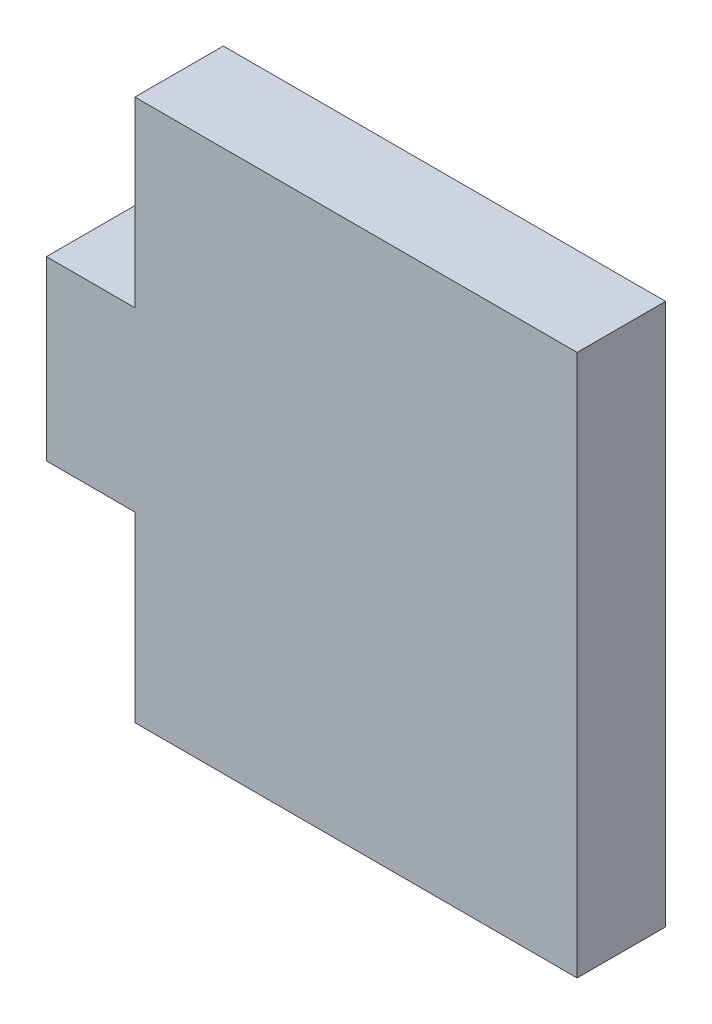
ISO-10303-21;
HEADER;
FILE_DESCRIPTION(('STEP AP214'),'2;1');
FILE_NAME('part.step','',(''),(''),'','','');
FILE_SCHEMA(('AUTOMOTIVE_DESIGN { 1 0 10303 214 1 1 1 1 }'));
ENDSEC;
DATA;
#1=APPLICATION_CONTEXT('core data for automotive mechanical design processes');
#2=APPLICATION_PROTOCOL_DEFINITION('international standard','automotive_design',2000,#1);
#3=PRODUCT_CONTEXT('',#1,'mechanical');
#4=PRODUCT('Part','Part','',(#3));
#5=PRODUCT_RELATED_PRODUCT_CATEGORY('part','',(#4));
#6=PRODUCT_DEFINITION_FORMATION('','',#4);
#7=PRODUCT_DEFINITION_CONTEXT('part definition',#1,'design');
#8=PRODUCT_DEFINITION('design','',#6,#7);
#9=PRODUCT_DEFINITION_SHAPE('','',#8);
#10=(LENGTH_UNIT() NAMED_UNIT(*) SI_UNIT(.MILLI.,.METRE.));
#11=(NAMED_UNIT(*) PLANE_ANGLE_UNIT() SI_UNIT($,.RADIAN.));
#12=(NAMED_UNIT(*) SI_UNIT($,.STERADIAN.) SOLID_ANGLE_UNIT());
#13=UNCERTAINTY_MEASURE_WITH_UNIT(LENGTH_MEASURE(1.E-05),#10,'distance_accuracy_value','');
#14=(GEOMETRIC_REPRESENTATION_CONTEXT(3) GLOBAL_UNCERTAINTY_ASSIGNED_CONTEXT((#13)) GLOBAL_UNIT_ASSIGNED_CONTEXT((#10,
#11,#12)) REPRESENTATION_CONTEXT('',''));
#15=CARTESIAN_POINT('',(0.,0.,0.));
#16=DIRECTION('',(0.,0.,1.));
#17=DIRECTION('',(1.,0.,0.));
#18=AXIS2_PLACEMENT_3D('',#15,#16,#17);
#19=CARTESIAN_POINT('',(12.,12.25,4.00000000000005));
#20=DIRECTION('',(-1.,0.,0.));
#21=DIRECTION('',(0.,-1.,0.));
#22=AXIS2_PLACEMENT_3D('',#19,#20,#21);
#23=PLANE('',#22);
#24=DIRECTION('',(0.,1.,0.));
#25=VECTOR('',#24,1.);
#26=CARTESIAN_POINT('',(12.,12.25,0.));
#27=LINE('',#26,#25);
#28=CARTESIAN_POINT('',(12.,-12.25,0.));
#29=VERTEX_POINT('',#28);
#30=CARTESIAN_POINT('',(12.,12.25,0.));
#31=VERTEX_POINT('',#30);
#32=EDGE_CURVE('E126',#29,#31,#27,.T.);
#33=ORIENTED_EDGE('',*,*,#32,.T.);
#34=DIRECTION('',(0.,0.,-1.));
#35=VECTOR('',#34,1.);
#36=CARTESIAN_POINT('',(12.,12.25,4.00000000000005));
#37=LINE('',#36,#35);
#38=CARTESIAN_POINT('',(12.,12.25,4.00000000000005));
#39=VERTEX_POINT('',#38);
#40=EDGE_CURVE('E11',#39,#31,#37,.T.);
#41=ORIENTED_EDGE('',*,*,#40,.F.);
#42=DIRECTION('',(0.,1.,0.));
#43=VECTOR('',#42,1.);
#44=CARTESIAN_POINT('',(12.,12.25,4.00000000000005));
#45=LINE('',#44,#43);
#46=CARTESIAN_POINT('',(12.,-12.25,4.));
#47=VERTEX_POINT('',#46);
#48=EDGE_CURVE('E140',#47,#39,#45,.T.);
#49=ORIENTED_EDGE('',*,*,#48,.F.);
#50=DIRECTION('',(0.,0.,-1.));
#51=VECTOR('',#50,1.);
#52=CARTESIAN_POINT('',(12.,-12.25,4.));
#53=LINE('',#52,#51);
#54=EDGE_CURVE('E122',#47,#29,#53,.T.);
#55=ORIENTED_EDGE('',*,*,#54,.T.);
#56=EDGE_LOOP('',(#33,#41,#49,#55));
#57=FACE_BOUND('',#56,.T.);
#58=ADVANCED_FACE('F30',(#57),#23,.F.);
#59=CARTESIAN_POINT('',(12.,12.25,4.00000000000005));
#60=DIRECTION('',(0.,-1.,0.));
#61=DIRECTION('',(1.,0.,0.));
#62=AXIS2_PLACEMENT_3D('',#59,#60,#61);
#63=PLANE('',#62);
#64=DIRECTION('',(-1.,0.,0.));
#65=VECTOR('',#64,1.);
#66=CARTESIAN_POINT('',(12.,12.25,0.));
#67=LINE('',#66,#65);
#68=CARTESIAN_POINT('',(-7.99999999999995,12.25,0.));
#69=VERTEX_POINT('',#68);
#70=EDGE_CURVE('E129',#31,#69,#67,.T.);
#71=ORIENTED_EDGE('',*,*,#70,.T.);
#72=DIRECTION('',(0.,0.,-1.));
#73=VECTOR('',#72,1.);
#74=CARTESIAN_POINT('',(-8.,12.25,4.));
#75=LINE('',#74,#73);
#76=CARTESIAN_POINT('',(-8.,12.25,4.));
#77=VERTEX_POINT('',#76);
#78=EDGE_CURVE('E38',#77,#69,#75,.T.);
#79=ORIENTED_EDGE('',*,*,#78,.F.);
#80=DIRECTION('',(-1.,0.,0.));
#81=VECTOR('',#80,1.);
#82=CARTESIAN_POINT('',(12.,12.25,4.00000000000005));
#83=LINE('',#82,#81);
#84=EDGE_CURVE('E89',#39,#77,#83,.T.);
#85=ORIENTED_EDGE('',*,*,#84,.F.);
#86=ORIENTED_EDGE('',*,*,#40,.T.);
#87=EDGE_LOOP('',(#71,#79,#85,#86));
#88=FACE_BOUND('',#87,.T.);
#89=ADVANCED_FACE('F175',(#88),#63,.F.);
#90=CARTESIAN_POINT('',(-8.,4.00000000000002,4.));
#91=DIRECTION('',(1.,0.,0.));
#92=DIRECTION('',(0.,0.,-1.));
#93=AXIS2_PLACEMENT_3D('',#90,#91,#92);
#94=PLANE('',#93);
#95=DIRECTION('',(0.,-1.,0.));
#96=VECTOR('',#95,1.);
#97=CARTESIAN_POINT('',(-8.,4.00000000000001,0.));
#98=LINE('',#97,#96);
#99=CARTESIAN_POINT('',(-8.,4.00000000000001,0.));
#100=VERTEX_POINT('',#99);
#101=EDGE_CURVE('E131',#69,#100,#98,.T.);
#102=ORIENTED_EDGE('',*,*,#101,.T.);
#103=DIRECTION('',(0.,0.,-1.));
#104=VECTOR('',#103,1.);
#105=CARTESIAN_POINT('',(-8.,4.00000000000002,4.));
#106=LINE('',#105,#104);
#107=CARTESIAN_POINT('',(-8.,4.00000000000002,4.));
#108=VERTEX_POINT('',#107);
#109=EDGE_CURVE('E147',#108,#100,#106,.T.);
#110=ORIENTED_EDGE('',*,*,#109,.F.);
#111=DIRECTION('',(0.,-1.,0.));
#112=VECTOR('',#111,1.);
#113=CARTESIAN_POINT('',(-8.,4.00000000000002,4.));
#114=LINE('',#113,#112);
#115=EDGE_CURVE('E155',#77,#108,#114,.T.);
#116=ORIENTED_EDGE('',*,*,#115,.F.);
#117=ORIENTED_EDGE('',*,*,#78,.T.);
#118=EDGE_LOOP('',(#102,#110,#116,#117));
#119=FACE_BOUND('',#118,.T.);
#120=ADVANCED_FACE('F153',(#119),#94,.F.);
#121=CARTESIAN_POINT('',(-12.,4.,4.));
#122=DIRECTION('',(0.,-1.,0.));
#123=DIRECTION('',(1.,0.,0.));
#124=AXIS2_PLACEMENT_3D('',#121,#122,#123);
#125=PLANE('',#124);
#126=DIRECTION('',(-1.,0.,0.));
#127=VECTOR('',#126,1.);
#128=CARTESIAN_POINT('',(-12.,3.99999999999999,0.));
#129=LINE('',#128,#127);
#130=CARTESIAN_POINT('',(-12.,3.99999999999999,0.));
#131=VERTEX_POINT('',#130);
#132=EDGE_CURVE('E133',#100,#131,#129,.T.);
#133=ORIENTED_EDGE('',*,*,#132,.T.);
#134=DIRECTION('',(0.,0.,-1.));
#135=VECTOR('',#134,1.);
#136=CARTESIAN_POINT('',(-12.,4.,4.));
#137=LINE('',#136,#135);
#138=CARTESIAN_POINT('',(-12.,4.,4.));
#139=VERTEX_POINT('',#138);
#140=EDGE_CURVE('E144',#139,#131,#137,.T.);
#141=ORIENTED_EDGE('',*,*,#140,.F.);
#142=DIRECTION('',(-1.,0.,0.));
#143=VECTOR('',#142,1.);
#144=CARTESIAN_POINT('',(-12.,4.,4.));
#145=LINE('',#144,#143);
#146=EDGE_CURVE('E167',#108,#139,#145,.T.);
#147=ORIENTED_EDGE('',*,*,#146,.F.);
#148=ORIENTED_EDGE('',*,*,#109,.T.);
#149=EDGE_LOOP('',(#133,#141,#147,#148));
#150=FACE_BOUND('',#149,.T.);
#151=ADVANCED_FACE('F163',(#150),#125,.F.);
#152=CARTESIAN_POINT('',(-12.,4.,4.));
#153=DIRECTION('',(1.,0.,0.));
#154=DIRECTION('',(0.,0.,-1.));
#155=AXIS2_PLACEMENT_3D('',#152,#153,#154);
#156=PLANE('',#155);
#157=DIRECTION('',(0.,-1.,0.));
#158=VECTOR('',#157,1.);
#159=CARTESIAN_POINT('',(-12.,3.99999999999999,0.));
#160=LINE('',#159,#158);
#161=CARTESIAN_POINT('',(-12.,-4.,0.));
#162=VERTEX_POINT('',#161);
#163=EDGE_CURVE('E135',#131,#162,#160,.T.);
#164=ORIENTED_EDGE('',*,*,#163,.T.);
#165=DIRECTION('',(0.,0.,-1.));
#166=VECTOR('',#165,1.);
#167=CARTESIAN_POINT('',(-12.,-4.00000000000002,4.00000000000001));
#168=LINE('',#167,#166);
#169=CARTESIAN_POINT('',(-12.,-4.00000000000002,4.00000000000001));
#170=VERTEX_POINT('',#169);
#171=EDGE_CURVE('E117',#170,#162,#168,.T.);
#172=ORIENTED_EDGE('',*,*,#171,.F.);
#173=DIRECTION('',(0.,-1.,0.));
#174=VECTOR('',#173,1.);
#175=CARTESIAN_POINT('',(-12.,4.,4.));
#176=LINE('',#175,#174);
#177=EDGE_CURVE('E108',#139,#170,#176,.T.);
#178=ORIENTED_EDGE('',*,*,#177,.F.);
#179=ORIENTED_EDGE('',*,*,#140,.T.);
#180=EDGE_LOOP('',(#164,#172,#178,#179));
#181=FACE_BOUND('',#180,.T.);
#182=ADVANCED_FACE('F166',(#181),#156,.F.);
#183=CARTESIAN_POINT('',(-8.00000000000001,-4.00000000000003,4.00000000000003));
#184=DIRECTION('',(0.,1.,0.));
#185=DIRECTION('',(0.,0.,1.));
#186=AXIS2_PLACEMENT_3D('',#183,#184,#185);
#187=PLANE('',#186);
#188=DIRECTION('',(1.,0.,0.));
#189=VECTOR('',#188,1.);
#190=CARTESIAN_POINT('',(-8.,-4.00000000000002,0.));
#191=LINE('',#190,#189);
#192=CARTESIAN_POINT('',(-8.,-4.00000000000002,0.));
#193=VERTEX_POINT('',#192);
#194=EDGE_CURVE('E116',#162,#193,#191,.T.);
#195=ORIENTED_EDGE('',*,*,#194,.T.);
#196=DIRECTION('',(0.,0.,-1.));
#197=VECTOR('',#196,1.);
#198=CARTESIAN_POINT('',(-8.00000000000001,-4.00000000000003,4.00000000000003));
#199=LINE('',#198,#197);
#200=CARTESIAN_POINT('',(-8.00000000000001,-4.00000000000003,4.00000000000003));
#201=VERTEX_POINT('',#200);
#202=EDGE_CURVE('E113',#201,#193,#199,.T.);
#203=ORIENTED_EDGE('',*,*,#202,.F.);
#204=DIRECTION('',(1.,0.,0.));
#205=VECTOR('',#204,1.);
#206=CARTESIAN_POINT('',(-8.00000000000001,-4.00000000000003,4.00000000000003));
#207=LINE('',#206,#205);
#208=EDGE_CURVE('E102',#170,#201,#207,.T.);
#209=ORIENTED_EDGE('',*,*,#208,.F.);
#210=ORIENTED_EDGE('',*,*,#171,.T.);
#211=EDGE_LOOP('',(#195,#203,#209,#210));
#212=FACE_BOUND('',#211,.T.);
#213=ADVANCED_FACE('F114',(#212),#187,.F.);
#214=CARTESIAN_POINT('',(-8.00000000000001,-4.00000000000003,4.00000000000003));
#215=DIRECTION('',(1.,0.,0.));
#216=DIRECTION('',(0.,1.,0.));
#217=AXIS2_PLACEMENT_3D('',#214,#215,#216);
#218=PLANE('',#217);
#219=DIRECTION('',(0.,-1.,0.));
#220=VECTOR('',#219,1.);
#221=CARTESIAN_POINT('',(-8.,-4.00000000000002,0.));
#222=LINE('',#221,#220);
#223=CARTESIAN_POINT('',(-8.,-12.25,0.));
#224=VERTEX_POINT('',#223);
#225=EDGE_CURVE('E75',#193,#224,#222,.T.);
#226=ORIENTED_EDGE('',*,*,#225,.T.);
#227=DIRECTION('',(0.,0.,-1.));
#228=VECTOR('',#227,1.);
#229=CARTESIAN_POINT('',(-8.,-12.25,4.));
#230=LINE('',#229,#228);
#231=CARTESIAN_POINT('',(-8.,-12.25,4.));
#232=VERTEX_POINT('',#231);
#233=EDGE_CURVE('E118',#232,#224,#230,.T.);
#234=ORIENTED_EDGE('',*,*,#233,.F.);
#235=DIRECTION('',(0.,-1.,0.));
#236=VECTOR('',#235,1.);
#237=CARTESIAN_POINT('',(-8.00000000000001,-4.00000000000003,4.00000000000003));
#238=LINE('',#237,#236);
#239=EDGE_CURVE('E106',#201,#232,#238,.T.);
#240=ORIENTED_EDGE('',*,*,#239,.F.);
#241=ORIENTED_EDGE('',*,*,#202,.T.);
#242=EDGE_LOOP('',(#226,#234,#240,#241));
#243=FACE_BOUND('',#242,.T.);
#244=ADVANCED_FACE('F120',(#243),#218,.F.);
#245=CARTESIAN_POINT('',(12.,-12.25,4.));
#246=DIRECTION('',(0.,1.,0.));
#247=DIRECTION('',(0.,0.,1.));
#248=AXIS2_PLACEMENT_3D('',#245,#246,#247);
#249=PLANE('',#248);
#250=DIRECTION('',(1.,0.,0.));
#251=VECTOR('',#250,1.);
#252=CARTESIAN_POINT('',(12.,-12.25,0.));
#253=LINE('',#252,#251);
#254=EDGE_CURVE('E81',#224,#29,#253,.T.);
#255=ORIENTED_EDGE('',*,*,#254,.T.);
#256=ORIENTED_EDGE('',*,*,#54,.F.);
#257=DIRECTION('',(1.,0.,0.));
#258=VECTOR('',#257,1.);
#259=CARTESIAN_POINT('',(12.,-12.25,4.));
#260=LINE('',#259,#258);
#261=EDGE_CURVE('E46',#232,#47,#260,.T.);
#262=ORIENTED_EDGE('',*,*,#261,.F.);
#263=ORIENTED_EDGE('',*,*,#233,.T.);
#264=EDGE_LOOP('',(#255,#256,#262,#263));
#265=FACE_BOUND('',#264,.T.);
#266=ADVANCED_FACE('F191',(#265),#249,.F.);
#267=CARTESIAN_POINT('',(12.,-12.25,4.));
#268=DIRECTION('',(0.,0.,-1.));
#269=DIRECTION('',(-1.,0.,0.));
#270=AXIS2_PLACEMENT_3D('',#267,#268,#269);
#271=PLANE('',#270);
#272=ORIENTED_EDGE('',*,*,#48,.T.);
#273=ORIENTED_EDGE('',*,*,#84,.T.);
#274=ORIENTED_EDGE('',*,*,#115,.T.);
#275=ORIENTED_EDGE('',*,*,#146,.T.);
#276=ORIENTED_EDGE('',*,*,#177,.T.);
#277=ORIENTED_EDGE('',*,*,#208,.T.);
#278=ORIENTED_EDGE('',*,*,#239,.T.);
#279=ORIENTED_EDGE('',*,*,#261,.T.);
#280=EDGE_LOOP('',(#272,#273,#274,#275,#276,#277,#278,#279));
#281=FACE_BOUND('',#280,.T.);
#282=ADVANCED_FACE('F104',(#281),#271,.F.);
#283=CARTESIAN_POINT('',(12.,-12.25,0.));
#284=DIRECTION('',(0.,0.,-1.));
#285=DIRECTION('',(-1.,0.,0.));
#286=AXIS2_PLACEMENT_3D('',#283,#284,#285);
#287=PLANE('',#286);
#288=ORIENTED_EDGE('',*,*,#32,.F.);
#289=ORIENTED_EDGE('',*,*,#254,.F.);
#290=ORIENTED_EDGE('',*,*,#225,.F.);
#291=ORIENTED_EDGE('',*,*,#194,.F.);
#292=ORIENTED_EDGE('',*,*,#163,.F.);
#293=ORIENTED_EDGE('',*,*,#132,.F.);
#294=ORIENTED_EDGE('',*,*,#101,.F.);
#295=ORIENTED_EDGE('',*,*,#70,.F.);
#296=EDGE_LOOP('',(#288,#289,#290,#291,#292,#293,#294,#295));
#297=FACE_BOUND('',#296,.T.);
#298=ADVANCED_FACE('F159',(#297),#287,.T.);
#299=CLOSED_SHELL('',(#58,#89,#120,#151,#182,#213,#244,#266,#282,#298));
#300=MANIFOLD_SOLID_BREP('B2',#299);
#301=ADVANCED_BREP_SHAPE_REPRESENTATION('',(#18,#300),#14);
#302=SHAPE_DEFINITION_REPRESENTATION(#9,#301);
ENDSEC;
END-ISO-10303-21;
